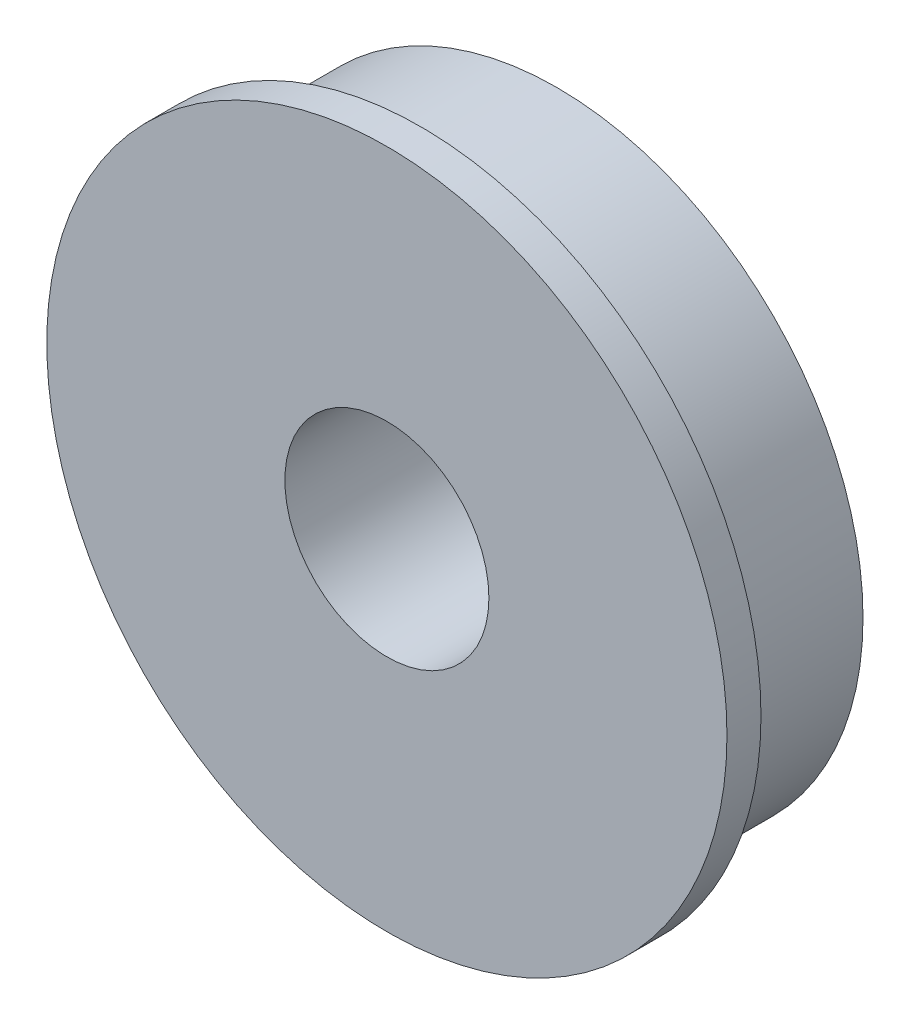
ISO-10303-21;
HEADER;
FILE_DESCRIPTION(('STEP AP214'),'2;1');
FILE_NAME('part.step','',(''),(''),'','','');
FILE_SCHEMA(('AUTOMOTIVE_DESIGN { 1 0 10303 214 1 1 1 1 }'));
ENDSEC;
DATA;
#1=APPLICATION_CONTEXT('core data for automotive mechanical design processes');
#2=APPLICATION_PROTOCOL_DEFINITION('international standard','automotive_design',2000,#1);
#3=PRODUCT_CONTEXT('',#1,'mechanical');
#4=PRODUCT('Part','Part','',(#3));
#5=PRODUCT_RELATED_PRODUCT_CATEGORY('part','',(#4));
#6=PRODUCT_DEFINITION_FORMATION('','',#4);
#7=PRODUCT_DEFINITION_CONTEXT('part definition',#1,'design');
#8=PRODUCT_DEFINITION('design','',#6,#7);
#9=PRODUCT_DEFINITION_SHAPE('','',#8);
#10=(LENGTH_UNIT() NAMED_UNIT(*) SI_UNIT(.MILLI.,.METRE.));
#11=(NAMED_UNIT(*) PLANE_ANGLE_UNIT() SI_UNIT($,.RADIAN.));
#12=(NAMED_UNIT(*) SI_UNIT($,.STERADIAN.) SOLID_ANGLE_UNIT());
#13=UNCERTAINTY_MEASURE_WITH_UNIT(LENGTH_MEASURE(1.E-05),#10,'distance_accuracy_value','');
#14=(GEOMETRIC_REPRESENTATION_CONTEXT(3) GLOBAL_UNCERTAINTY_ASSIGNED_CONTEXT((#13)) GLOBAL_UNIT_ASSIGNED_CONTEXT((#10,
#11,#12)) REPRESENTATION_CONTEXT('',''));
#15=CARTESIAN_POINT('',(0.,0.,0.));
#16=DIRECTION('',(0.,0.,1.));
#17=DIRECTION('',(1.,0.,0.));
#18=AXIS2_PLACEMENT_3D('',#15,#16,#17);
#19=CARTESIAN_POINT('',(0.,15.875,0.));
#20=DIRECTION('',(0.,0.,-1.));
#21=DIRECTION('',(-1.,0.,0.));
#22=AXIS2_PLACEMENT_3D('',#19,#20,#21);
#23=PLANE('',#22);
#24=CARTESIAN_POINT('',(0.,0.,0.));
#25=DIRECTION('',(0.,0.,1.));
#26=DIRECTION('',(1.,0.,0.));
#27=AXIS2_PLACEMENT_3D('',#24,#25,#26);
#28=CIRCLE('',#27,4.7625);
#29=CARTESIAN_POINT('',(4.7625,0.,0.));
#30=VERTEX_POINT('',#29);
#31=EDGE_CURVE('E10',#30,#30,#28,.T.);
#32=ORIENTED_EDGE('',*,*,#31,.F.);
#33=EDGE_LOOP('',(#32));
#34=FACE_BOUND('',#33,.T.);
#35=CARTESIAN_POINT('',(0.,0.,0.));
#36=DIRECTION('',(0.,0.,1.));
#37=DIRECTION('',(1.,0.,0.));
#38=AXIS2_PLACEMENT_3D('',#35,#36,#37);
#39=CIRCLE('',#38,15.875);
#40=CARTESIAN_POINT('',(15.875,0.,0.));
#41=VERTEX_POINT('',#40);
#42=EDGE_CURVE('E55',#41,#41,#39,.T.);
#43=ORIENTED_EDGE('',*,*,#42,.T.);
#44=EDGE_LOOP('',(#43));
#45=FACE_BOUND('',#44,.T.);
#46=ADVANCED_FACE('F33',(#34,#45),#23,.F.);
#47=CARTESIAN_POINT('',(0.,0.,0.));
#48=DIRECTION('',(0.,0.,1.));
#49=DIRECTION('',(1.,0.,0.));
#50=AXIS2_PLACEMENT_3D('',#47,#48,#49);
#51=CYLINDRICAL_SURFACE('',#50,4.7625);
#52=CARTESIAN_POINT('',(0.,0.,-7.9375));
#53=DIRECTION('',(0.,0.,1.));
#54=DIRECTION('',(1.,0.,0.));
#55=AXIS2_PLACEMENT_3D('',#52,#53,#54);
#56=CIRCLE('',#55,4.7625);
#57=CARTESIAN_POINT('',(4.7625,0.,-7.9375));
#58=VERTEX_POINT('',#57);
#59=EDGE_CURVE('E39',#58,#58,#56,.T.);
#60=ORIENTED_EDGE('',*,*,#59,.F.);
#61=EDGE_LOOP('',(#60));
#62=FACE_BOUND('',#61,.T.);
#63=ORIENTED_EDGE('',*,*,#31,.T.);
#64=EDGE_LOOP('',(#63));
#65=FACE_BOUND('',#64,.T.);
#66=ADVANCED_FACE('F80',(#62,#65),#51,.F.);
#67=CARTESIAN_POINT('',(0.,4.7625,-7.9375));
#68=DIRECTION('',(0.,0.,1.));
#69=DIRECTION('',(1.,0.,0.));
#70=AXIS2_PLACEMENT_3D('',#67,#68,#69);
#71=PLANE('',#70);
#72=CARTESIAN_POINT('',(0.,0.,-7.9375));
#73=DIRECTION('',(0.,0.,1.));
#74=DIRECTION('',(1.,0.,0.));
#75=AXIS2_PLACEMENT_3D('',#72,#73,#74);
#76=CIRCLE('',#75,14.2875);
#77=CARTESIAN_POINT('',(14.2875,0.,-7.9375));
#78=VERTEX_POINT('',#77);
#79=EDGE_CURVE('E43',#78,#78,#76,.T.);
#80=ORIENTED_EDGE('',*,*,#79,.F.);
#81=EDGE_LOOP('',(#80));
#82=FACE_BOUND('',#81,.T.);
#83=ORIENTED_EDGE('',*,*,#59,.T.);
#84=EDGE_LOOP('',(#83));
#85=FACE_BOUND('',#84,.T.);
#86=ADVANCED_FACE('F75',(#82,#85),#71,.F.);
#87=CARTESIAN_POINT('',(0.,0.,0.));
#88=DIRECTION('',(0.,0.,1.));
#89=DIRECTION('',(1.,0.,0.));
#90=AXIS2_PLACEMENT_3D('',#87,#88,#89);
#91=CYLINDRICAL_SURFACE('',#90,14.2875);
#92=CARTESIAN_POINT('',(0.,0.,-1.5875));
#93=DIRECTION('',(0.,0.,1.));
#94=DIRECTION('',(1.,0.,0.));
#95=AXIS2_PLACEMENT_3D('',#92,#93,#94);
#96=CIRCLE('',#95,14.2875);
#97=CARTESIAN_POINT('',(14.2875,0.,-1.5875));
#98=VERTEX_POINT('',#97);
#99=EDGE_CURVE('E47',#98,#98,#96,.T.);
#100=ORIENTED_EDGE('',*,*,#99,.F.);
#101=EDGE_LOOP('',(#100));
#102=FACE_BOUND('',#101,.T.);
#103=ORIENTED_EDGE('',*,*,#79,.T.);
#104=EDGE_LOOP('',(#103));
#105=FACE_BOUND('',#104,.T.);
#106=ADVANCED_FACE('F69',(#102,#105),#91,.T.);
#107=CARTESIAN_POINT('',(0.,14.2875,-1.5875));
#108=DIRECTION('',(0.,0.,1.));
#109=DIRECTION('',(1.,0.,0.));
#110=AXIS2_PLACEMENT_3D('',#107,#108,#109);
#111=PLANE('',#110);
#112=CARTESIAN_POINT('',(0.,0.,-1.5875));
#113=DIRECTION('',(0.,0.,1.));
#114=DIRECTION('',(1.,0.,0.));
#115=AXIS2_PLACEMENT_3D('',#112,#113,#114);
#116=CIRCLE('',#115,15.875);
#117=CARTESIAN_POINT('',(15.875,0.,-1.5875));
#118=VERTEX_POINT('',#117);
#119=EDGE_CURVE('E52',#118,#118,#116,.T.);
#120=ORIENTED_EDGE('',*,*,#119,.F.);
#121=EDGE_LOOP('',(#120));
#122=FACE_BOUND('',#121,.T.);
#123=ORIENTED_EDGE('',*,*,#99,.T.);
#124=EDGE_LOOP('',(#123));
#125=FACE_BOUND('',#124,.T.);
#126=ADVANCED_FACE('F63',(#122,#125),#111,.F.);
#127=CARTESIAN_POINT('',(0.,0.,0.));
#128=DIRECTION('',(0.,0.,1.));
#129=DIRECTION('',(1.,0.,0.));
#130=AXIS2_PLACEMENT_3D('',#127,#128,#129);
#131=CYLINDRICAL_SURFACE('',#130,15.875);
#132=ORIENTED_EDGE('',*,*,#42,.F.);
#133=EDGE_LOOP('',(#132));
#134=FACE_BOUND('',#133,.T.);
#135=ORIENTED_EDGE('',*,*,#119,.T.);
#136=EDGE_LOOP('',(#135));
#137=FACE_BOUND('',#136,.T.);
#138=ADVANCED_FACE('F60',(#134,#137),#131,.T.);
#139=CLOSED_SHELL('',(#46,#66,#86,#106,#126,#138));
#140=MANIFOLD_SOLID_BREP('B2',#139);
#141=ADVANCED_BREP_SHAPE_REPRESENTATION('',(#18,#140),#14);
#142=SHAPE_DEFINITION_REPRESENTATION(#9,#141);
ENDSEC;
END-ISO-10303-21;
